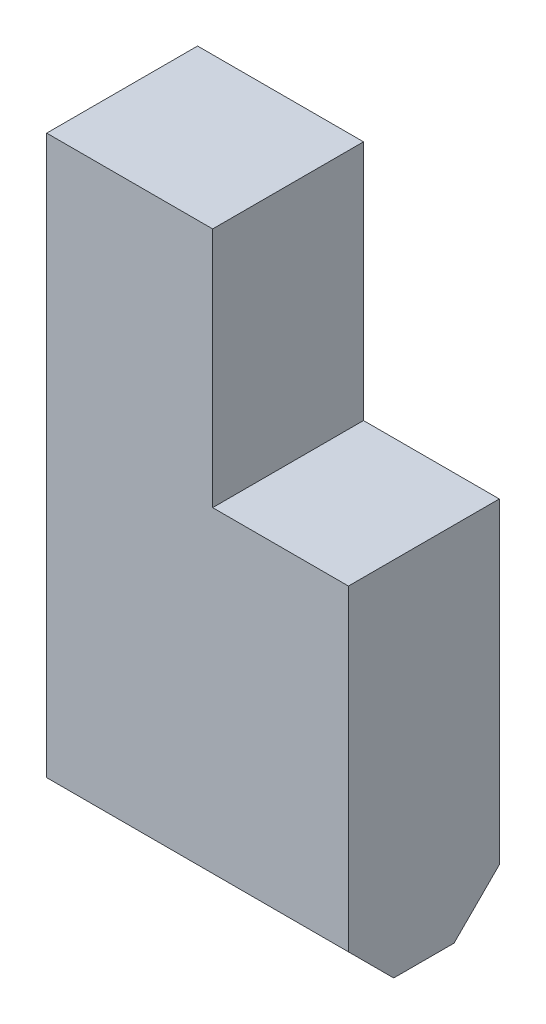
ISO-10303-21;
HEADER;
FILE_DESCRIPTION(('STEP AP214'),'2;1');
FILE_NAME('part.step','',(''),(''),'','','');
FILE_SCHEMA(('AUTOMOTIVE_DESIGN { 1 0 10303 214 1 1 1 1 }'));
ENDSEC;
DATA;
#1=APPLICATION_CONTEXT('core data for automotive mechanical design processes');
#2=APPLICATION_PROTOCOL_DEFINITION('international standard','automotive_design',2000,#1);
#3=PRODUCT_CONTEXT('',#1,'mechanical');
#4=PRODUCT('Part','Part','',(#3));
#5=PRODUCT_RELATED_PRODUCT_CATEGORY('part','',(#4));
#6=PRODUCT_DEFINITION_FORMATION('','',#4);
#7=PRODUCT_DEFINITION_CONTEXT('part definition',#1,'design');
#8=PRODUCT_DEFINITION('design','',#6,#7);
#9=PRODUCT_DEFINITION_SHAPE('','',#8);
#10=(LENGTH_UNIT() NAMED_UNIT(*) SI_UNIT(.MILLI.,.METRE.));
#11=(NAMED_UNIT(*) PLANE_ANGLE_UNIT() SI_UNIT($,.RADIAN.));
#12=(NAMED_UNIT(*) SI_UNIT($,.STERADIAN.) SOLID_ANGLE_UNIT());
#13=UNCERTAINTY_MEASURE_WITH_UNIT(LENGTH_MEASURE(1.E-05),#10,'distance_accuracy_value','');
#14=(GEOMETRIC_REPRESENTATION_CONTEXT(3) GLOBAL_UNCERTAINTY_ASSIGNED_CONTEXT((#13)) GLOBAL_UNIT_ASSIGNED_CONTEXT((#10,
#11,#12)) REPRESENTATION_CONTEXT('',''));
#15=CARTESIAN_POINT('',(0.,0.,0.));
#16=DIRECTION('',(0.,0.,1.));
#17=DIRECTION('',(1.,0.,0.));
#18=AXIS2_PLACEMENT_3D('',#15,#16,#17);
#19=CARTESIAN_POINT('',(0.,0.,5.));
#20=DIRECTION('',(1.,0.,0.));
#21=DIRECTION('',(0.,0.,-1.));
#22=AXIS2_PLACEMENT_3D('',#19,#20,#21);
#23=PLANE('',#22);
#24=DIRECTION('',(0.,0.,-1.));
#25=VECTOR('',#24,1.);
#26=CARTESIAN_POINT('',(0.,0.,5.));
#27=LINE('',#26,#25);
#28=CARTESIAN_POINT('',(0.,0.,1.99999999999999));
#29=VERTEX_POINT('',#28);
#30=CARTESIAN_POINT('',(0.,0.,-2.));
#31=VERTEX_POINT('',#30);
#32=EDGE_CURVE('E159',#29,#31,#27,.T.);
#33=ORIENTED_EDGE('',*,*,#32,.F.);
#34=DIRECTION('',(0.,-0.707106781186546,-0.707106781186549));
#35=VECTOR('',#34,1.);
#36=CARTESIAN_POINT('',(0.,3.,5.));
#37=LINE('',#36,#35);
#38=CARTESIAN_POINT('',(0.,3.,5.));
#39=VERTEX_POINT('',#38);
#40=EDGE_CURVE('E49',#29,#39,#37,.F.);
#41=ORIENTED_EDGE('',*,*,#40,.T.);
#42=DIRECTION('',(0.,-1.,0.));
#43=VECTOR('',#42,1.);
#44=CARTESIAN_POINT('',(0.,0.,5.));
#45=LINE('',#44,#43);
#46=CARTESIAN_POINT('',(0.,40.,5.));
#47=VERTEX_POINT('',#46);
#48=EDGE_CURVE('E119',#47,#39,#45,.T.);
#49=ORIENTED_EDGE('',*,*,#48,.F.);
#50=DIRECTION('',(0.,0.,-1.));
#51=VECTOR('',#50,1.);
#52=CARTESIAN_POINT('',(0.,40.,5.));
#53=LINE('',#52,#51);
#54=CARTESIAN_POINT('',(0.,40.,-5.));
#55=VERTEX_POINT('',#54);
#56=EDGE_CURVE('E140',#47,#55,#53,.T.);
#57=ORIENTED_EDGE('',*,*,#56,.T.);
#58=DIRECTION('',(0.,-1.,0.));
#59=VECTOR('',#58,1.);
#60=CARTESIAN_POINT('',(0.,0.,-5.));
#61=LINE('',#60,#59);
#62=CARTESIAN_POINT('',(0.,3.00000000000001,-5.));
#63=VERTEX_POINT('',#62);
#64=EDGE_CURVE('E141',#55,#63,#61,.T.);
#65=ORIENTED_EDGE('',*,*,#64,.T.);
#66=DIRECTION('',(0.,-0.707106781186548,0.707106781186547));
#67=VECTOR('',#66,1.);
#68=CARTESIAN_POINT('',(0.,0.,-2.));
#69=LINE('',#68,#67);
#70=EDGE_CURVE('E61',#63,#31,#69,.T.);
#71=ORIENTED_EDGE('',*,*,#70,.T.);
#72=EDGE_LOOP('',(#33,#41,#49,#57,#65,#71));
#73=FACE_BOUND('',#72,.T.);
#74=ADVANCED_FACE('F40',(#73),#23,.F.);
#75=CARTESIAN_POINT('',(0.,0.,5.));
#76=DIRECTION('',(0.,1.,0.));
#77=DIRECTION('',(0.,0.,1.));
#78=AXIS2_PLACEMENT_3D('',#75,#76,#77);
#79=PLANE('',#78);
#80=DIRECTION('',(0.,0.,-1.));
#81=VECTOR('',#80,1.);
#82=CARTESIAN_POINT('',(20.,0.,5.));
#83=LINE('',#82,#81);
#84=CARTESIAN_POINT('',(20.,0.,1.99999999999999));
#85=VERTEX_POINT('',#84);
#86=CARTESIAN_POINT('',(20.,0.,-2.));
#87=VERTEX_POINT('',#86);
#88=EDGE_CURVE('E127',#85,#87,#83,.T.);
#89=ORIENTED_EDGE('',*,*,#88,.F.);
#90=DIRECTION('',(-1.,0.,0.));
#91=VECTOR('',#90,1.);
#92=CARTESIAN_POINT('',(0.,0.,1.99999999999999));
#93=LINE('',#92,#91);
#94=EDGE_CURVE('E172',#85,#29,#93,.T.);
#95=ORIENTED_EDGE('',*,*,#94,.T.);
#96=ORIENTED_EDGE('',*,*,#32,.T.);
#97=DIRECTION('',(1.,0.,0.));
#98=VECTOR('',#97,1.);
#99=CARTESIAN_POINT('',(20.,0.,-2.));
#100=LINE('',#99,#98);
#101=EDGE_CURVE('E168',#31,#87,#100,.T.);
#102=ORIENTED_EDGE('',*,*,#101,.T.);
#103=EDGE_LOOP('',(#89,#95,#96,#102));
#104=FACE_BOUND('',#103,.T.);
#105=ADVANCED_FACE('F184',(#104),#79,.F.);
#106=CARTESIAN_POINT('',(20.,0.,5.));
#107=DIRECTION('',(-1.,0.,0.));
#108=DIRECTION('',(0.,0.,1.));
#109=AXIS2_PLACEMENT_3D('',#106,#107,#108);
#110=PLANE('',#109);
#111=DIRECTION('',(0.,1.,0.));
#112=VECTOR('',#111,1.);
#113=CARTESIAN_POINT('',(20.,0.,5.));
#114=LINE('',#113,#112);
#115=CARTESIAN_POINT('',(20.,3.,5.));
#116=VERTEX_POINT('',#115);
#117=CARTESIAN_POINT('',(20.,24.,5.));
#118=VERTEX_POINT('',#117);
#119=EDGE_CURVE('E109',#116,#118,#114,.T.);
#120=ORIENTED_EDGE('',*,*,#119,.F.);
#121=DIRECTION('',(0.,0.707106781186546,0.707106781186549));
#122=VECTOR('',#121,1.);
#123=CARTESIAN_POINT('',(20.,3.,5.));
#124=LINE('',#123,#122);
#125=EDGE_CURVE('E165',#116,#85,#124,.F.);
#126=ORIENTED_EDGE('',*,*,#125,.T.);
#127=ORIENTED_EDGE('',*,*,#88,.T.);
#128=DIRECTION('',(0.,0.707106781186548,-0.707106781186547));
#129=VECTOR('',#128,1.);
#130=CARTESIAN_POINT('',(20.,0.,-2.));
#131=LINE('',#130,#129);
#132=CARTESIAN_POINT('',(20.,3.00000000000001,-5.));
#133=VERTEX_POINT('',#132);
#134=EDGE_CURVE('E162',#87,#133,#131,.T.);
#135=ORIENTED_EDGE('',*,*,#134,.T.);
#136=DIRECTION('',(0.,1.,0.));
#137=VECTOR('',#136,1.);
#138=CARTESIAN_POINT('',(20.,0.,-5.));
#139=LINE('',#138,#137);
#140=CARTESIAN_POINT('',(20.,24.,-5.));
#141=VERTEX_POINT('',#140);
#142=EDGE_CURVE('E124',#133,#141,#139,.T.);
#143=ORIENTED_EDGE('',*,*,#142,.T.);
#144=DIRECTION('',(0.,0.,-1.));
#145=VECTOR('',#144,1.);
#146=CARTESIAN_POINT('',(20.,24.,5.));
#147=LINE('',#146,#145);
#148=EDGE_CURVE('E122',#118,#141,#147,.T.);
#149=ORIENTED_EDGE('',*,*,#148,.F.);
#150=EDGE_LOOP('',(#120,#126,#127,#135,#143,#149));
#151=FACE_BOUND('',#150,.T.);
#152=ADVANCED_FACE('F123',(#151),#110,.F.);
#153=CARTESIAN_POINT('',(20.,24.,5.));
#154=DIRECTION('',(0.,-1.,0.));
#155=DIRECTION('',(0.,0.,-1.));
#156=AXIS2_PLACEMENT_3D('',#153,#154,#155);
#157=PLANE('',#156);
#158=DIRECTION('',(-1.,0.,0.));
#159=VECTOR('',#158,1.);
#160=CARTESIAN_POINT('',(20.,24.,-5.));
#161=LINE('',#160,#159);
#162=CARTESIAN_POINT('',(11.,24.,-5.));
#163=VERTEX_POINT('',#162);
#164=EDGE_CURVE('E144',#141,#163,#161,.T.);
#165=ORIENTED_EDGE('',*,*,#164,.T.);
#166=DIRECTION('',(0.,0.,-1.));
#167=VECTOR('',#166,1.);
#168=CARTESIAN_POINT('',(11.,24.,5.));
#169=LINE('',#168,#167);
#170=CARTESIAN_POINT('',(11.,24.,5.));
#171=VERTEX_POINT('',#170);
#172=EDGE_CURVE('E128',#171,#163,#169,.T.);
#173=ORIENTED_EDGE('',*,*,#172,.F.);
#174=DIRECTION('',(-1.,0.,0.));
#175=VECTOR('',#174,1.);
#176=CARTESIAN_POINT('',(20.,24.,5.));
#177=LINE('',#176,#175);
#178=EDGE_CURVE('E114',#118,#171,#177,.T.);
#179=ORIENTED_EDGE('',*,*,#178,.F.);
#180=ORIENTED_EDGE('',*,*,#148,.T.);
#181=EDGE_LOOP('',(#165,#173,#179,#180));
#182=FACE_BOUND('',#181,.T.);
#183=ADVANCED_FACE('F130',(#182),#157,.F.);
#184=CARTESIAN_POINT('',(11.,24.,5.));
#185=DIRECTION('',(-1.,0.,0.));
#186=DIRECTION('',(0.,0.,1.));
#187=AXIS2_PLACEMENT_3D('',#184,#185,#186);
#188=PLANE('',#187);
#189=DIRECTION('',(0.,1.,0.));
#190=VECTOR('',#189,1.);
#191=CARTESIAN_POINT('',(11.,24.,-5.));
#192=LINE('',#191,#190);
#193=CARTESIAN_POINT('',(11.,40.,-5.));
#194=VERTEX_POINT('',#193);
#195=EDGE_CURVE('E146',#163,#194,#192,.T.);
#196=ORIENTED_EDGE('',*,*,#195,.T.);
#197=DIRECTION('',(0.,0.,-1.));
#198=VECTOR('',#197,1.);
#199=CARTESIAN_POINT('',(11.,40.,5.));
#200=LINE('',#199,#198);
#201=CARTESIAN_POINT('',(11.,40.,5.));
#202=VERTEX_POINT('',#201);
#203=EDGE_CURVE('E152',#202,#194,#200,.T.);
#204=ORIENTED_EDGE('',*,*,#203,.F.);
#205=DIRECTION('',(0.,1.,0.));
#206=VECTOR('',#205,1.);
#207=CARTESIAN_POINT('',(11.,24.,5.));
#208=LINE('',#207,#206);
#209=EDGE_CURVE('E133',#171,#202,#208,.T.);
#210=ORIENTED_EDGE('',*,*,#209,.F.);
#211=ORIENTED_EDGE('',*,*,#172,.T.);
#212=EDGE_LOOP('',(#196,#204,#210,#211));
#213=FACE_BOUND('',#212,.T.);
#214=ADVANCED_FACE('F191',(#213),#188,.F.);
#215=CARTESIAN_POINT('',(0.,40.,5.));
#216=DIRECTION('',(0.,-1.,0.));
#217=DIRECTION('',(0.,0.,-1.));
#218=AXIS2_PLACEMENT_3D('',#215,#216,#217);
#219=PLANE('',#218);
#220=DIRECTION('',(-1.,0.,0.));
#221=VECTOR('',#220,1.);
#222=CARTESIAN_POINT('',(0.,40.,-5.));
#223=LINE('',#222,#221);
#224=EDGE_CURVE('E148',#194,#55,#223,.T.);
#225=ORIENTED_EDGE('',*,*,#224,.T.);
#226=ORIENTED_EDGE('',*,*,#56,.F.);
#227=DIRECTION('',(-1.,0.,0.));
#228=VECTOR('',#227,1.);
#229=CARTESIAN_POINT('',(0.,40.,5.));
#230=LINE('',#229,#228);
#231=EDGE_CURVE('E135',#202,#47,#230,.T.);
#232=ORIENTED_EDGE('',*,*,#231,.F.);
#233=ORIENTED_EDGE('',*,*,#203,.T.);
#234=EDGE_LOOP('',(#225,#226,#232,#233));
#235=FACE_BOUND('',#234,.T.);
#236=ADVANCED_FACE('F194',(#235),#219,.F.);
#237=CARTESIAN_POINT('',(0.,0.,5.));
#238=DIRECTION('',(0.,0.,-1.));
#239=DIRECTION('',(-1.,0.,0.));
#240=AXIS2_PLACEMENT_3D('',#237,#238,#239);
#241=PLANE('',#240);
#242=ORIENTED_EDGE('',*,*,#48,.T.);
#243=DIRECTION('',(1.,0.,0.));
#244=VECTOR('',#243,1.);
#245=CARTESIAN_POINT('',(0.,3.,5.));
#246=LINE('',#245,#244);
#247=EDGE_CURVE('E117',#39,#116,#246,.T.);
#248=ORIENTED_EDGE('',*,*,#247,.T.);
#249=ORIENTED_EDGE('',*,*,#119,.T.);
#250=ORIENTED_EDGE('',*,*,#178,.T.);
#251=ORIENTED_EDGE('',*,*,#209,.T.);
#252=ORIENTED_EDGE('',*,*,#231,.T.);
#253=EDGE_LOOP('',(#242,#248,#249,#250,#251,#252));
#254=FACE_BOUND('',#253,.T.);
#255=ADVANCED_FACE('F112',(#254),#241,.F.);
#256=CARTESIAN_POINT('',(0.,0.,-5.));
#257=DIRECTION('',(0.,0.,-1.));
#258=DIRECTION('',(-1.,0.,0.));
#259=AXIS2_PLACEMENT_3D('',#256,#257,#258);
#260=PLANE('',#259);
#261=ORIENTED_EDGE('',*,*,#142,.F.);
#262=DIRECTION('',(-1.,0.,0.));
#263=VECTOR('',#262,1.);
#264=CARTESIAN_POINT('',(0.,3.00000000000001,-5.));
#265=LINE('',#264,#263);
#266=EDGE_CURVE('E11',#133,#63,#265,.T.);
#267=ORIENTED_EDGE('',*,*,#266,.T.);
#268=ORIENTED_EDGE('',*,*,#64,.F.);
#269=ORIENTED_EDGE('',*,*,#224,.F.);
#270=ORIENTED_EDGE('',*,*,#195,.F.);
#271=ORIENTED_EDGE('',*,*,#164,.F.);
#272=EDGE_LOOP('',(#261,#267,#268,#269,#270,#271));
#273=FACE_BOUND('',#272,.T.);
#274=ADVANCED_FACE('F187',(#273),#260,.T.);
#275=CARTESIAN_POINT('',(0.,3.,5.));
#276=DIRECTION('',(0.,0.707106781186549,-0.707106781186546));
#277=DIRECTION('',(1.,0.,0.));
#278=AXIS2_PLACEMENT_3D('',#275,#276,#277);
#279=PLANE('',#278);
#280=ORIENTED_EDGE('',*,*,#40,.F.);
#281=ORIENTED_EDGE('',*,*,#94,.F.);
#282=ORIENTED_EDGE('',*,*,#125,.F.);
#283=ORIENTED_EDGE('',*,*,#247,.F.);
#284=EDGE_LOOP('',(#280,#281,#282,#283));
#285=FACE_BOUND('',#284,.T.);
#286=ADVANCED_FACE('F181',(#285),#279,.F.);
#287=CARTESIAN_POINT('',(0.,0.,-2.));
#288=DIRECTION('',(0.,-0.707106781186547,-0.707106781186548));
#289=DIRECTION('',(-1.,0.,0.));
#290=AXIS2_PLACEMENT_3D('',#287,#288,#289);
#291=PLANE('',#290);
#292=ORIENTED_EDGE('',*,*,#70,.F.);
#293=ORIENTED_EDGE('',*,*,#266,.F.);
#294=ORIENTED_EDGE('',*,*,#134,.F.);
#295=ORIENTED_EDGE('',*,*,#101,.F.);
#296=EDGE_LOOP('',(#292,#293,#294,#295));
#297=FACE_BOUND('',#296,.T.);
#298=ADVANCED_FACE('F43',(#297),#291,.T.);
#299=CLOSED_SHELL('',(#74,#105,#152,#183,#214,#236,#255,#274,#286,#298));
#300=MANIFOLD_SOLID_BREP('B2',#299);
#301=ADVANCED_BREP_SHAPE_REPRESENTATION('',(#18,#300),#14);
#302=SHAPE_DEFINITION_REPRESENTATION(#9,#301);
ENDSEC;
END-ISO-10303-21;
